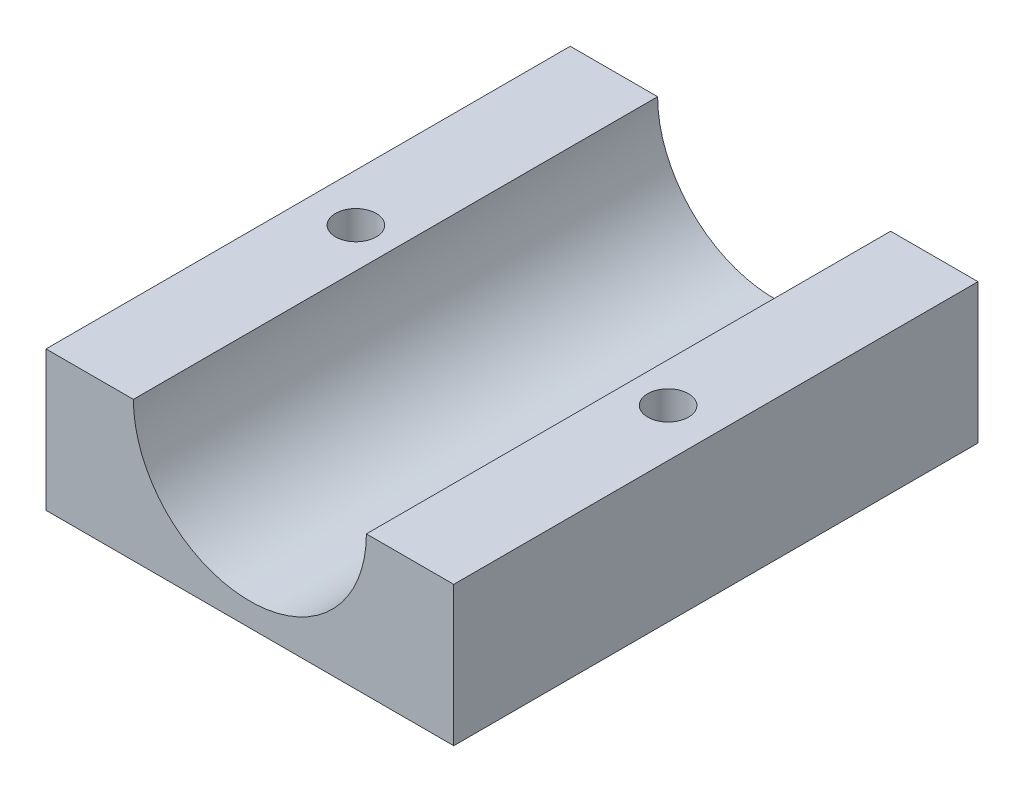
ISO-10303-21;
HEADER;
FILE_DESCRIPTION(('STEP AP214'),'2;1');
FILE_NAME('part.step','',(''),(''),'','','');
FILE_SCHEMA(('AUTOMOTIVE_DESIGN { 1 0 10303 214 1 1 1 1 }'));
ENDSEC;
DATA;
#1=APPLICATION_CONTEXT('core data for automotive mechanical design processes');
#2=APPLICATION_PROTOCOL_DEFINITION('international standard','automotive_design',2000,#1);
#3=PRODUCT_CONTEXT('',#1,'mechanical');
#4=PRODUCT('Part','Part','',(#3));
#5=PRODUCT_RELATED_PRODUCT_CATEGORY('part','',(#4));
#6=PRODUCT_DEFINITION_FORMATION('','',#4);
#7=PRODUCT_DEFINITION_CONTEXT('part definition',#1,'design');
#8=PRODUCT_DEFINITION('design','',#6,#7);
#9=PRODUCT_DEFINITION_SHAPE('','',#8);
#10=(LENGTH_UNIT() NAMED_UNIT(*) SI_UNIT(.MILLI.,.METRE.));
#11=(NAMED_UNIT(*) PLANE_ANGLE_UNIT() SI_UNIT($,.RADIAN.));
#12=(NAMED_UNIT(*) SI_UNIT($,.STERADIAN.) SOLID_ANGLE_UNIT());
#13=UNCERTAINTY_MEASURE_WITH_UNIT(LENGTH_MEASURE(1.E-05),#10,'distance_accuracy_value','');
#14=(GEOMETRIC_REPRESENTATION_CONTEXT(3) GLOBAL_UNCERTAINTY_ASSIGNED_CONTEXT((#13)) GLOBAL_UNIT_ASSIGNED_CONTEXT((#10,
#11,#12)) REPRESENTATION_CONTEXT('',''));
#15=CARTESIAN_POINT('',(0.,0.,0.));
#16=DIRECTION('',(0.,0.,1.));
#17=DIRECTION('',(1.,0.,0.));
#18=AXIS2_PLACEMENT_3D('',#15,#16,#17);
#19=CARTESIAN_POINT('',(0.,12.,0.));
#20=DIRECTION('',(0.,-1.,0.));
#21=DIRECTION('',(0.,0.,-1.));
#22=AXIS2_PLACEMENT_3D('',#19,#20,#21);
#23=PLANE('',#22);
#24=CARTESIAN_POINT('',(30.9,12.,-22.5));
#25=DIRECTION('',(0.,1.,0.));
#26=DIRECTION('',(0.,0.,1.));
#27=AXIS2_PLACEMENT_3D('',#24,#25,#26);
#28=CIRCLE('',#27,1.75);
#29=CARTESIAN_POINT('',(30.9,12.,-20.75));
#30=VERTEX_POINT('',#29);
#31=EDGE_CURVE('E135',#30,#30,#28,.T.);
#32=ORIENTED_EDGE('',*,*,#31,.F.);
#33=EDGE_LOOP('',(#32));
#34=FACE_BOUND('',#33,.T.);
#35=DIRECTION('',(-1.,0.,0.));
#36=VECTOR('',#35,1.);
#37=CARTESIAN_POINT('',(0.,12.,-45.));
#38=LINE('',#37,#36);
#39=CARTESIAN_POINT('',(35.,12.,-45.));
#40=VERTEX_POINT('',#39);
#41=CARTESIAN_POINT('',(27.5,12.,-45.));
#42=VERTEX_POINT('',#41);
#43=EDGE_CURVE('E107',#40,#42,#38,.T.);
#44=ORIENTED_EDGE('',*,*,#43,.T.);
#45=DIRECTION('',(0.,0.,1.));
#46=VECTOR('',#45,1.);
#47=CARTESIAN_POINT('',(27.5,12.,-45.));
#48=LINE('',#47,#46);
#49=CARTESIAN_POINT('',(27.5,12.,0.));
#50=VERTEX_POINT('',#49);
#51=EDGE_CURVE('E11',#42,#50,#48,.T.);
#52=ORIENTED_EDGE('',*,*,#51,.T.);
#53=DIRECTION('',(1.,0.,0.));
#54=VECTOR('',#53,1.);
#55=CARTESIAN_POINT('',(0.,12.,0.));
#56=LINE('',#55,#54);
#57=CARTESIAN_POINT('',(35.,12.,0.));
#58=VERTEX_POINT('',#57);
#59=EDGE_CURVE('E104',#50,#58,#56,.T.);
#60=ORIENTED_EDGE('',*,*,#59,.T.);
#61=DIRECTION('',(0.,0.,-1.));
#62=VECTOR('',#61,1.);
#63=CARTESIAN_POINT('',(35.,12.,0.));
#64=LINE('',#63,#62);
#65=EDGE_CURVE('E114',#58,#40,#64,.T.);
#66=ORIENTED_EDGE('',*,*,#65,.T.);
#67=EDGE_LOOP('',(#44,#52,#60,#66));
#68=FACE_BOUND('',#67,.T.);
#69=ADVANCED_FACE('F34',(#34,#68),#23,.F.);
#70=CARTESIAN_POINT('',(0.,12.,0.));
#71=DIRECTION('',(1.,0.,0.));
#72=DIRECTION('',(0.,0.,-1.));
#73=AXIS2_PLACEMENT_3D('',#70,#71,#72);
#74=PLANE('',#73);
#75=DIRECTION('',(0.,0.,1.));
#76=VECTOR('',#75,1.);
#77=CARTESIAN_POINT('',(0.,0.,0.));
#78=LINE('',#77,#76);
#79=CARTESIAN_POINT('',(0.,0.,-45.));
#80=VERTEX_POINT('',#79);
#81=CARTESIAN_POINT('',(0.,0.,0.));
#82=VERTEX_POINT('',#81);
#83=EDGE_CURVE('E120',#80,#82,#78,.T.);
#84=ORIENTED_EDGE('',*,*,#83,.T.);
#85=DIRECTION('',(0.,-1.,0.));
#86=VECTOR('',#85,1.);
#87=CARTESIAN_POINT('',(0.,12.,0.));
#88=LINE('',#87,#86);
#89=CARTESIAN_POINT('',(0.,12.,0.));
#90=VERTEX_POINT('',#89);
#91=EDGE_CURVE('E132',#90,#82,#88,.T.);
#92=ORIENTED_EDGE('',*,*,#91,.F.);
#93=DIRECTION('',(0.,0.,1.));
#94=VECTOR('',#93,1.);
#95=CARTESIAN_POINT('',(0.,12.,0.));
#96=LINE('',#95,#94);
#97=CARTESIAN_POINT('',(0.,12.,-45.));
#98=VERTEX_POINT('',#97);
#99=EDGE_CURVE('E112',#98,#90,#96,.T.);
#100=ORIENTED_EDGE('',*,*,#99,.F.);
#101=DIRECTION('',(0.,-1.,0.));
#102=VECTOR('',#101,1.);
#103=CARTESIAN_POINT('',(0.,12.,-45.));
#104=LINE('',#103,#102);
#105=EDGE_CURVE('E119',#98,#80,#104,.T.);
#106=ORIENTED_EDGE('',*,*,#105,.T.);
#107=EDGE_LOOP('',(#84,#92,#100,#106));
#108=FACE_BOUND('',#107,.T.);
#109=ADVANCED_FACE('F36',(#108),#74,.F.);
#110=CARTESIAN_POINT('',(0.,12.,0.));
#111=DIRECTION('',(0.,0.,-1.));
#112=DIRECTION('',(-1.,0.,0.));
#113=AXIS2_PLACEMENT_3D('',#110,#111,#112);
#114=PLANE('',#113);
#115=ORIENTED_EDGE('',*,*,#59,.F.);
#116=CARTESIAN_POINT('',(17.5,12.,0.));
#117=DIRECTION('',(0.,0.,1.));
#118=DIRECTION('',(1.,0.,0.));
#119=AXIS2_PLACEMENT_3D('',#116,#117,#118);
#120=CIRCLE('',#119,10.);
#121=CARTESIAN_POINT('',(7.5,12.,0.));
#122=VERTEX_POINT('',#121);
#123=EDGE_CURVE('E97',#122,#50,#120,.T.);
#124=ORIENTED_EDGE('',*,*,#123,.F.);
#125=EDGE_CURVE('E89',#90,#122,#56,.T.);
#126=ORIENTED_EDGE('',*,*,#125,.F.);
#127=ORIENTED_EDGE('',*,*,#91,.T.);
#128=DIRECTION('',(1.,0.,0.));
#129=VECTOR('',#128,1.);
#130=CARTESIAN_POINT('',(0.,0.,0.));
#131=LINE('',#130,#129);
#132=CARTESIAN_POINT('',(35.,0.,0.));
#133=VERTEX_POINT('',#132);
#134=EDGE_CURVE('E123',#82,#133,#131,.T.);
#135=ORIENTED_EDGE('',*,*,#134,.T.);
#136=DIRECTION('',(0.,-1.,0.));
#137=VECTOR('',#136,1.);
#138=CARTESIAN_POINT('',(35.,12.,0.));
#139=LINE('',#138,#137);
#140=EDGE_CURVE('E110',#58,#133,#139,.T.);
#141=ORIENTED_EDGE('',*,*,#140,.F.);
#142=EDGE_LOOP('',(#115,#124,#126,#127,#135,#141));
#143=FACE_BOUND('',#142,.T.);
#144=ADVANCED_FACE('F108',(#143),#114,.F.);
#145=CARTESIAN_POINT('',(35.,12.,0.));
#146=DIRECTION('',(-1.,0.,0.));
#147=DIRECTION('',(0.,0.,1.));
#148=AXIS2_PLACEMENT_3D('',#145,#146,#147);
#149=PLANE('',#148);
#150=DIRECTION('',(0.,0.,-1.));
#151=VECTOR('',#150,1.);
#152=CARTESIAN_POINT('',(35.,0.,0.));
#153=LINE('',#152,#151);
#154=CARTESIAN_POINT('',(35.,0.,-45.));
#155=VERTEX_POINT('',#154);
#156=EDGE_CURVE('E125',#133,#155,#153,.T.);
#157=ORIENTED_EDGE('',*,*,#156,.T.);
#158=DIRECTION('',(0.,-1.,0.));
#159=VECTOR('',#158,1.);
#160=CARTESIAN_POINT('',(35.,12.,-45.));
#161=LINE('',#160,#159);
#162=EDGE_CURVE('E129',#40,#155,#161,.T.);
#163=ORIENTED_EDGE('',*,*,#162,.F.);
#164=ORIENTED_EDGE('',*,*,#65,.F.);
#165=ORIENTED_EDGE('',*,*,#140,.T.);
#166=EDGE_LOOP('',(#157,#163,#164,#165));
#167=FACE_BOUND('',#166,.T.);
#168=ADVANCED_FACE('F162',(#167),#149,.F.);
#169=CARTESIAN_POINT('',(0.,12.,-45.));
#170=DIRECTION('',(0.,0.,1.));
#171=DIRECTION('',(1.,0.,0.));
#172=AXIS2_PLACEMENT_3D('',#169,#170,#171);
#173=PLANE('',#172);
#174=CARTESIAN_POINT('',(7.5,12.,-45.));
#175=VERTEX_POINT('',#174);
#176=EDGE_CURVE('E59',#175,#98,#38,.T.);
#177=ORIENTED_EDGE('',*,*,#176,.F.);
#178=CARTESIAN_POINT('',(17.5,12.,-45.));
#179=DIRECTION('',(0.,0.,1.));
#180=DIRECTION('',(1.,0.,0.));
#181=AXIS2_PLACEMENT_3D('',#178,#179,#180);
#182=CIRCLE('',#181,10.);
#183=EDGE_CURVE('E51',#175,#42,#182,.T.);
#184=ORIENTED_EDGE('',*,*,#183,.T.);
#185=ORIENTED_EDGE('',*,*,#43,.F.);
#186=ORIENTED_EDGE('',*,*,#162,.T.);
#187=DIRECTION('',(-1.,0.,0.));
#188=VECTOR('',#187,1.);
#189=CARTESIAN_POINT('',(0.,0.,-45.));
#190=LINE('',#189,#188);
#191=EDGE_CURVE('E81',#155,#80,#190,.T.);
#192=ORIENTED_EDGE('',*,*,#191,.T.);
#193=ORIENTED_EDGE('',*,*,#105,.F.);
#194=EDGE_LOOP('',(#177,#184,#185,#186,#192,#193));
#195=FACE_BOUND('',#194,.T.);
#196=ADVANCED_FACE('F146',(#195),#173,.F.);
#197=CARTESIAN_POINT('',(4.10000000000001,12.,-22.5));
#198=DIRECTION('',(0.,1.,0.));
#199=DIRECTION('',(0.,0.,1.));
#200=AXIS2_PLACEMENT_3D('',#197,#198,#199);
#201=CIRCLE('',#200,1.75);
#202=CARTESIAN_POINT('',(4.10000000000001,12.,-20.75));
#203=VERTEX_POINT('',#202);
#204=EDGE_CURVE('E143',#203,#203,#201,.T.);
#205=ORIENTED_EDGE('',*,*,#204,.F.);
#206=EDGE_LOOP('',(#205));
#207=FACE_BOUND('',#206,.T.);
#208=ORIENTED_EDGE('',*,*,#125,.T.);
#209=DIRECTION('',(0.,0.,1.));
#210=VECTOR('',#209,1.);
#211=CARTESIAN_POINT('',(7.5,12.,-45.));
#212=LINE('',#211,#210);
#213=EDGE_CURVE('E43',#122,#175,#212,.F.);
#214=ORIENTED_EDGE('',*,*,#213,.T.);
#215=ORIENTED_EDGE('',*,*,#176,.T.);
#216=ORIENTED_EDGE('',*,*,#99,.T.);
#217=EDGE_LOOP('',(#208,#214,#215,#216));
#218=FACE_BOUND('',#217,.T.);
#219=ADVANCED_FACE('F151',(#207,#218),#23,.F.);
#220=CARTESIAN_POINT('',(0.,0.,0.));
#221=DIRECTION('',(0.,-1.,0.));
#222=DIRECTION('',(0.,0.,-1.));
#223=AXIS2_PLACEMENT_3D('',#220,#221,#222);
#224=PLANE('',#223);
#225=CARTESIAN_POINT('',(4.10000000000001,0.,-22.5));
#226=DIRECTION('',(0.,-1.,0.));
#227=DIRECTION('',(0.,0.,-1.));
#228=AXIS2_PLACEMENT_3D('',#225,#226,#227);
#229=CIRCLE('',#228,1.75);
#230=CARTESIAN_POINT('',(4.10000000000001,0.,-24.25));
#231=VERTEX_POINT('',#230);
#232=EDGE_CURVE('E38',#231,#231,#229,.T.);
#233=ORIENTED_EDGE('',*,*,#232,.F.);
#234=EDGE_LOOP('',(#233));
#235=FACE_BOUND('',#234,.T.);
#236=CARTESIAN_POINT('',(30.9,0.,-22.5));
#237=DIRECTION('',(0.,-1.,0.));
#238=DIRECTION('',(0.,0.,-1.));
#239=AXIS2_PLACEMENT_3D('',#236,#237,#238);
#240=CIRCLE('',#239,1.75);
#241=CARTESIAN_POINT('',(30.9,0.,-24.25));
#242=VERTEX_POINT('',#241);
#243=EDGE_CURVE('E100',#242,#242,#240,.T.);
#244=ORIENTED_EDGE('',*,*,#243,.F.);
#245=EDGE_LOOP('',(#244));
#246=FACE_BOUND('',#245,.T.);
#247=ORIENTED_EDGE('',*,*,#83,.F.);
#248=ORIENTED_EDGE('',*,*,#191,.F.);
#249=ORIENTED_EDGE('',*,*,#156,.F.);
#250=ORIENTED_EDGE('',*,*,#134,.F.);
#251=EDGE_LOOP('',(#247,#248,#249,#250));
#252=FACE_BOUND('',#251,.T.);
#253=ADVANCED_FACE('F153',(#235,#246,#252),#224,.T.);
#254=CARTESIAN_POINT('',(17.5,12.,-45.));
#255=DIRECTION('',(0.,0.,1.));
#256=DIRECTION('',(1.,0.,0.));
#257=AXIS2_PLACEMENT_3D('',#254,#255,#256);
#258=CYLINDRICAL_SURFACE('',#257,10.);
#259=ORIENTED_EDGE('',*,*,#183,.F.);
#260=ORIENTED_EDGE('',*,*,#213,.F.);
#261=ORIENTED_EDGE('',*,*,#123,.T.);
#262=ORIENTED_EDGE('',*,*,#51,.F.);
#263=EDGE_LOOP('',(#259,#260,#261,#262));
#264=FACE_BOUND('',#263,.T.);
#265=ADVANCED_FACE('F98',(#264),#258,.F.);
#266=CARTESIAN_POINT('',(30.9,-13.,-22.5));
#267=DIRECTION('',(0.,1.,0.));
#268=DIRECTION('',(0.,0.,1.));
#269=AXIS2_PLACEMENT_3D('',#266,#267,#268);
#270=CYLINDRICAL_SURFACE('',#269,1.75);
#271=ORIENTED_EDGE('',*,*,#243,.T.);
#272=EDGE_LOOP('',(#271));
#273=FACE_BOUND('',#272,.T.);
#274=ORIENTED_EDGE('',*,*,#31,.T.);
#275=EDGE_LOOP('',(#274));
#276=FACE_BOUND('',#275,.T.);
#277=ADVANCED_FACE('F199',(#273,#276),#270,.F.);
#278=CARTESIAN_POINT('',(4.10000000000001,-13.,-22.5));
#279=DIRECTION('',(0.,1.,0.));
#280=DIRECTION('',(0.,0.,1.));
#281=AXIS2_PLACEMENT_3D('',#278,#279,#280);
#282=CYLINDRICAL_SURFACE('',#281,1.75);
#283=ORIENTED_EDGE('',*,*,#232,.T.);
#284=EDGE_LOOP('',(#283));
#285=FACE_BOUND('',#284,.T.);
#286=ORIENTED_EDGE('',*,*,#204,.T.);
#287=EDGE_LOOP('',(#286));
#288=FACE_BOUND('',#287,.T.);
#289=ADVANCED_FACE('F221',(#285,#288),#282,.F.);
#290=CLOSED_SHELL('',(#69,#109,#144,#168,#196,#219,#253,#265,#277,#289));
#291=MANIFOLD_SOLID_BREP('B2',#290);
#292=ADVANCED_BREP_SHAPE_REPRESENTATION('',(#18,#291),#14);
#293=SHAPE_DEFINITION_REPRESENTATION(#9,#292);
ENDSEC;
END-ISO-10303-21;
